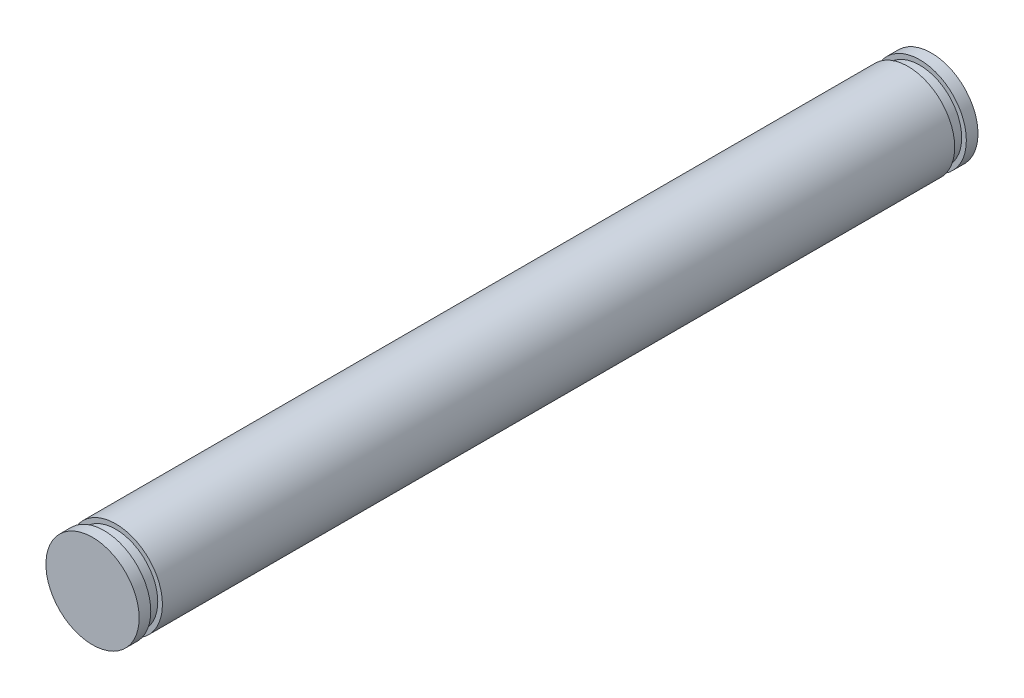
ISO-10303-21;
HEADER;
FILE_DESCRIPTION(('STEP AP214'),'2;1');
FILE_NAME('part.step','',(''),(''),'','','');
FILE_SCHEMA(('AUTOMOTIVE_DESIGN { 1 0 10303 214 1 1 1 1 }'));
ENDSEC;
DATA;
#1=APPLICATION_CONTEXT('core data for automotive mechanical design processes');
#2=APPLICATION_PROTOCOL_DEFINITION('international standard','automotive_design',2000,#1);
#3=PRODUCT_CONTEXT('',#1,'mechanical');
#4=PRODUCT('Part','Part','',(#3));
#5=PRODUCT_RELATED_PRODUCT_CATEGORY('part','',(#4));
#6=PRODUCT_DEFINITION_FORMATION('','',#4);
#7=PRODUCT_DEFINITION_CONTEXT('part definition',#1,'design');
#8=PRODUCT_DEFINITION('design','',#6,#7);
#9=PRODUCT_DEFINITION_SHAPE('','',#8);
#10=(LENGTH_UNIT() NAMED_UNIT(*) SI_UNIT(.MILLI.,.METRE.));
#11=(NAMED_UNIT(*) PLANE_ANGLE_UNIT() SI_UNIT($,.RADIAN.));
#12=(NAMED_UNIT(*) SI_UNIT($,.STERADIAN.) SOLID_ANGLE_UNIT());
#13=UNCERTAINTY_MEASURE_WITH_UNIT(LENGTH_MEASURE(1.E-05),#10,'distance_accuracy_value','');
#14=(GEOMETRIC_REPRESENTATION_CONTEXT(3) GLOBAL_UNCERTAINTY_ASSIGNED_CONTEXT((#13)) GLOBAL_UNIT_ASSIGNED_CONTEXT((#10,
#11,#12)) REPRESENTATION_CONTEXT('',''));
#15=CARTESIAN_POINT('',(0.,0.,0.));
#16=DIRECTION('',(0.,0.,1.));
#17=DIRECTION('',(1.,0.,0.));
#18=AXIS2_PLACEMENT_3D('',#15,#16,#17);
#19=CARTESIAN_POINT('',(0.,0.,36.));
#20=DIRECTION('',(0.,0.,-1.));
#21=DIRECTION('',(-1.,0.,0.));
#22=AXIS2_PLACEMENT_3D('',#19,#20,#21);
#23=CYLINDRICAL_SURFACE('',#22,4.);
#24=CARTESIAN_POINT('',(0.,0.,34.));
#25=DIRECTION('',(0.,0.,1.));
#26=DIRECTION('',(1.,0.,0.));
#27=AXIS2_PLACEMENT_3D('',#24,#25,#26);
#28=CIRCLE('',#27,4.);
#29=CARTESIAN_POINT('',(4.,0.,34.));
#30=VERTEX_POINT('',#29);
#31=EDGE_CURVE('E58',#30,#30,#28,.T.);
#32=ORIENTED_EDGE('',*,*,#31,.F.);
#33=EDGE_LOOP('',(#32));
#34=FACE_BOUND('',#33,.T.);
#35=CARTESIAN_POINT('',(0.,0.,-34.));
#36=DIRECTION('',(0.,0.,1.));
#37=DIRECTION('',(1.,0.,0.));
#38=AXIS2_PLACEMENT_3D('',#35,#36,#37);
#39=CIRCLE('',#38,4.);
#40=CARTESIAN_POINT('',(4.,0.,-34.));
#41=VERTEX_POINT('',#40);
#42=EDGE_CURVE('E74',#41,#41,#39,.T.);
#43=ORIENTED_EDGE('',*,*,#42,.T.);
#44=EDGE_LOOP('',(#43));
#45=FACE_BOUND('',#44,.T.);
#46=ADVANCED_FACE('F43',(#34,#45),#23,.T.);
#47=CARTESIAN_POINT('',(0.,0.,35.));
#48=DIRECTION('',(0.,0.,1.));
#49=DIRECTION('',(1.,0.,0.));
#50=AXIS2_PLACEMENT_3D('',#47,#48,#49);
#51=CIRCLE('',#50,4.);
#52=CARTESIAN_POINT('',(4.,0.,35.));
#53=VERTEX_POINT('',#52);
#54=EDGE_CURVE('E56',#53,#53,#51,.T.);
#55=ORIENTED_EDGE('',*,*,#54,.T.);
#56=EDGE_LOOP('',(#55));
#57=FACE_BOUND('',#56,.T.);
#58=CARTESIAN_POINT('',(0.,0.,36.));
#59=DIRECTION('',(0.,0.,1.));
#60=DIRECTION('',(1.,0.,0.));
#61=AXIS2_PLACEMENT_3D('',#58,#59,#60);
#62=CIRCLE('',#61,4.);
#63=CARTESIAN_POINT('',(4.,0.,36.));
#64=VERTEX_POINT('',#63);
#65=EDGE_CURVE('E10',#64,#64,#62,.T.);
#66=ORIENTED_EDGE('',*,*,#65,.F.);
#67=EDGE_LOOP('',(#66));
#68=FACE_BOUND('',#67,.T.);
#69=ADVANCED_FACE('F45',(#57,#68),#23,.T.);
#70=CARTESIAN_POINT('',(0.,0.,36.));
#71=DIRECTION('',(0.,0.,1.));
#72=DIRECTION('',(1.,0.,0.));
#73=AXIS2_PLACEMENT_3D('',#70,#71,#72);
#74=PLANE('',#73);
#75=ORIENTED_EDGE('',*,*,#65,.T.);
#76=EDGE_LOOP('',(#75));
#77=FACE_BOUND('',#76,.T.);
#78=ADVANCED_FACE('F120',(#77),#74,.T.);
#79=CARTESIAN_POINT('',(0.,0.,35.));
#80=DIRECTION('',(0.,0.,1.));
#81=DIRECTION('',(1.,0.,0.));
#82=AXIS2_PLACEMENT_3D('',#79,#80,#81);
#83=PLANE('',#82);
#84=ORIENTED_EDGE('',*,*,#54,.F.);
#85=EDGE_LOOP('',(#84));
#86=FACE_BOUND('',#85,.T.);
#87=CARTESIAN_POINT('',(0.,0.,35.));
#88=DIRECTION('',(0.,0.,1.));
#89=DIRECTION('',(1.,0.,0.));
#90=AXIS2_PLACEMENT_3D('',#87,#88,#89);
#91=CIRCLE('',#90,3.6);
#92=CARTESIAN_POINT('',(3.6,0.,35.));
#93=VERTEX_POINT('',#92);
#94=EDGE_CURVE('E62',#93,#93,#91,.T.);
#95=ORIENTED_EDGE('',*,*,#94,.T.);
#96=EDGE_LOOP('',(#95));
#97=FACE_BOUND('',#96,.T.);
#98=ADVANCED_FACE('F135',(#86,#97),#83,.F.);
#99=CARTESIAN_POINT('',(0.,0.,34.));
#100=DIRECTION('',(0.,0.,1.));
#101=DIRECTION('',(1.,0.,0.));
#102=AXIS2_PLACEMENT_3D('',#99,#100,#101);
#103=PLANE('',#102);
#104=ORIENTED_EDGE('',*,*,#31,.T.);
#105=EDGE_LOOP('',(#104));
#106=FACE_BOUND('',#105,.T.);
#107=CARTESIAN_POINT('',(0.,0.,34.));
#108=DIRECTION('',(0.,0.,1.));
#109=DIRECTION('',(1.,0.,0.));
#110=AXIS2_PLACEMENT_3D('',#107,#108,#109);
#111=CIRCLE('',#110,3.6);
#112=CARTESIAN_POINT('',(3.6,0.,34.));
#113=VERTEX_POINT('',#112);
#114=EDGE_CURVE('E66',#113,#113,#111,.T.);
#115=ORIENTED_EDGE('',*,*,#114,.F.);
#116=EDGE_LOOP('',(#115));
#117=FACE_BOUND('',#116,.T.);
#118=ADVANCED_FACE('F133',(#106,#117),#103,.T.);
#119=CARTESIAN_POINT('',(0.,0.,35.));
#120=DIRECTION('',(0.,0.,-1.));
#121=DIRECTION('',(-1.,0.,0.));
#122=AXIS2_PLACEMENT_3D('',#119,#120,#121);
#123=CYLINDRICAL_SURFACE('',#122,3.6);
#124=ORIENTED_EDGE('',*,*,#94,.F.);
#125=EDGE_LOOP('',(#124));
#126=FACE_BOUND('',#125,.T.);
#127=ORIENTED_EDGE('',*,*,#114,.T.);
#128=EDGE_LOOP('',(#127));
#129=FACE_BOUND('',#128,.T.);
#130=ADVANCED_FACE('F97',(#126,#129),#123,.T.);
#131=CARTESIAN_POINT('',(0.,0.,-35.));
#132=DIRECTION('',(0.,0.,-1.));
#133=DIRECTION('',(1.,0.,0.));
#134=AXIS2_PLACEMENT_3D('',#131,#132,#133);
#135=PLANE('',#134);
#136=CARTESIAN_POINT('',(0.,0.,-35.));
#137=DIRECTION('',(0.,0.,1.));
#138=DIRECTION('',(1.,0.,0.));
#139=AXIS2_PLACEMENT_3D('',#136,#137,#138);
#140=CIRCLE('',#139,3.6);
#141=CARTESIAN_POINT('',(3.6,0.,-35.));
#142=VERTEX_POINT('',#141);
#143=EDGE_CURVE('E78',#142,#142,#140,.T.);
#144=ORIENTED_EDGE('',*,*,#143,.F.);
#145=EDGE_LOOP('',(#144));
#146=FACE_BOUND('',#145,.T.);
#147=CARTESIAN_POINT('',(0.,0.,-35.));
#148=DIRECTION('',(0.,0.,1.));
#149=DIRECTION('',(1.,0.,0.));
#150=AXIS2_PLACEMENT_3D('',#147,#148,#149);
#151=CIRCLE('',#150,4.);
#152=CARTESIAN_POINT('',(4.,0.,-35.));
#153=VERTEX_POINT('',#152);
#154=EDGE_CURVE('E70',#153,#153,#151,.T.);
#155=ORIENTED_EDGE('',*,*,#154,.T.);
#156=EDGE_LOOP('',(#155));
#157=FACE_BOUND('',#156,.T.);
#158=ADVANCED_FACE('F93',(#146,#157),#135,.F.);
#159=CARTESIAN_POINT('',(0.,0.,-34.));
#160=DIRECTION('',(0.,0.,-1.));
#161=DIRECTION('',(1.,0.,0.));
#162=AXIS2_PLACEMENT_3D('',#159,#160,#161);
#163=PLANE('',#162);
#164=CARTESIAN_POINT('',(0.,0.,-34.));
#165=DIRECTION('',(0.,0.,1.));
#166=DIRECTION('',(1.,0.,0.));
#167=AXIS2_PLACEMENT_3D('',#164,#165,#166);
#168=CIRCLE('',#167,3.6);
#169=CARTESIAN_POINT('',(3.6,0.,-34.));
#170=VERTEX_POINT('',#169);
#171=EDGE_CURVE('E82',#170,#170,#168,.T.);
#172=ORIENTED_EDGE('',*,*,#171,.T.);
#173=EDGE_LOOP('',(#172));
#174=FACE_BOUND('',#173,.T.);
#175=ORIENTED_EDGE('',*,*,#42,.F.);
#176=EDGE_LOOP('',(#175));
#177=FACE_BOUND('',#176,.T.);
#178=ADVANCED_FACE('F96',(#174,#177),#163,.T.);
#179=CARTESIAN_POINT('',(0.,0.,-35.));
#180=DIRECTION('',(0.,0.,1.));
#181=DIRECTION('',(1.,0.,0.));
#182=AXIS2_PLACEMENT_3D('',#179,#180,#181);
#183=CYLINDRICAL_SURFACE('',#182,3.6);
#184=ORIENTED_EDGE('',*,*,#143,.T.);
#185=EDGE_LOOP('',(#184));
#186=FACE_BOUND('',#185,.T.);
#187=ORIENTED_EDGE('',*,*,#171,.F.);
#188=EDGE_LOOP('',(#187));
#189=FACE_BOUND('',#188,.T.);
#190=ADVANCED_FACE('F90',(#186,#189),#183,.T.);
#191=CARTESIAN_POINT('',(0.,0.,-36.));
#192=DIRECTION('',(0.,0.,1.));
#193=DIRECTION('',(1.,0.,0.));
#194=AXIS2_PLACEMENT_3D('',#191,#192,#193);
#195=PLANE('',#194);
#196=CARTESIAN_POINT('',(0.,0.,-36.));
#197=DIRECTION('',(0.,0.,1.));
#198=DIRECTION('',(1.,0.,0.));
#199=AXIS2_PLACEMENT_3D('',#196,#197,#198);
#200=CIRCLE('',#199,4.);
#201=CARTESIAN_POINT('',(4.,0.,-36.));
#202=VERTEX_POINT('',#201);
#203=EDGE_CURVE('E47',#202,#202,#200,.T.);
#204=ORIENTED_EDGE('',*,*,#203,.F.);
#205=EDGE_LOOP('',(#204));
#206=FACE_BOUND('',#205,.T.);
#207=ADVANCED_FACE('F104',(#206),#195,.F.);
#208=ORIENTED_EDGE('',*,*,#154,.F.);
#209=EDGE_LOOP('',(#208));
#210=FACE_BOUND('',#209,.T.);
#211=ORIENTED_EDGE('',*,*,#203,.T.);
#212=EDGE_LOOP('',(#211));
#213=FACE_BOUND('',#212,.T.);
#214=ADVANCED_FACE('F101',(#210,#213),#23,.T.);
#215=CLOSED_SHELL('',(#46,#69,#78,#98,#118,#130,#158,#178,#190,#207,#214));
#216=MANIFOLD_SOLID_BREP('B2',#215);
#217=ADVANCED_BREP_SHAPE_REPRESENTATION('',(#18,#216),#14);
#218=SHAPE_DEFINITION_REPRESENTATION(#9,#217);
ENDSEC;
END-ISO-10303-21;
